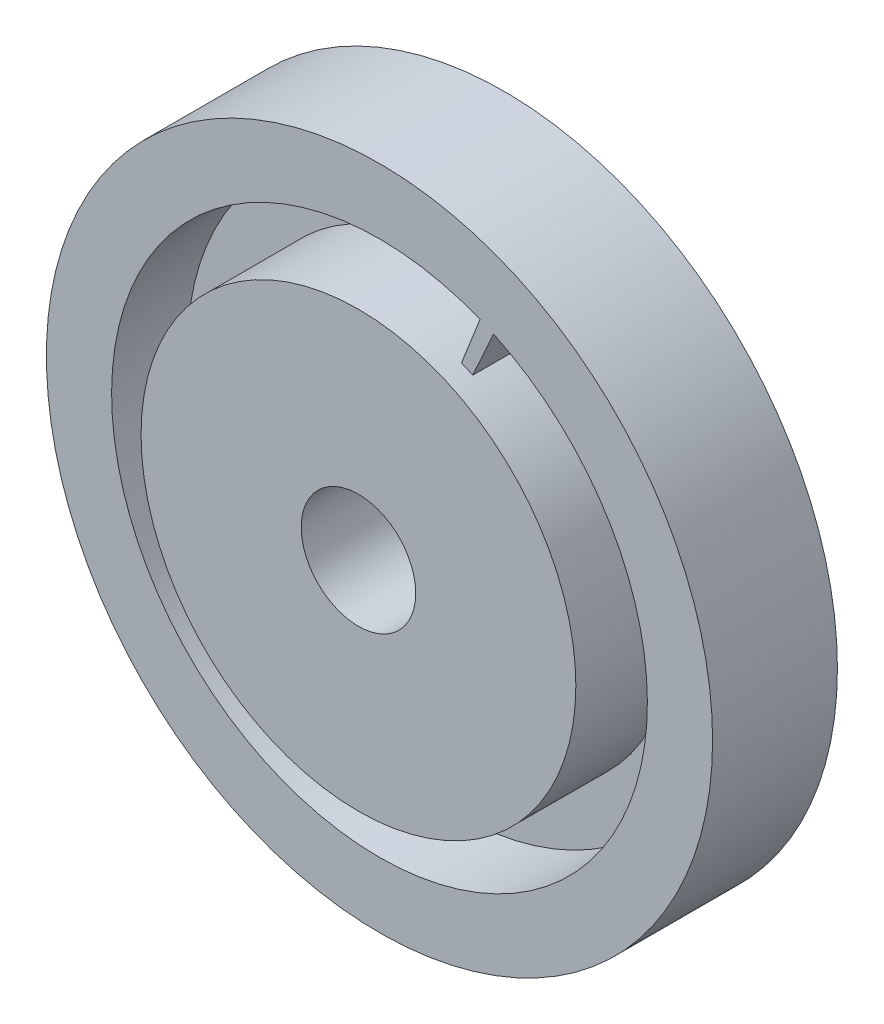
ISO-10303-21;
HEADER;
FILE_DESCRIPTION(('STEP AP214'),'2;1');
FILE_NAME('part.step','',(''),(''),'','','');
FILE_SCHEMA(('AUTOMOTIVE_DESIGN { 1 0 10303 214 1 1 1 1 }'));
ENDSEC;
DATA;
#1=APPLICATION_CONTEXT('core data for automotive mechanical design processes');
#2=APPLICATION_PROTOCOL_DEFINITION('international standard','automotive_design',2000,#1);
#3=PRODUCT_CONTEXT('',#1,'mechanical');
#4=PRODUCT('Part','Part','',(#3));
#5=PRODUCT_RELATED_PRODUCT_CATEGORY('part','',(#4));
#6=PRODUCT_DEFINITION_FORMATION('','',#4);
#7=PRODUCT_DEFINITION_CONTEXT('part definition',#1,'design');
#8=PRODUCT_DEFINITION('design','',#6,#7);
#9=PRODUCT_DEFINITION_SHAPE('','',#8);
#10=(LENGTH_UNIT() NAMED_UNIT(*) SI_UNIT(.MILLI.,.METRE.));
#11=(NAMED_UNIT(*) PLANE_ANGLE_UNIT() SI_UNIT($,.RADIAN.));
#12=(NAMED_UNIT(*) SI_UNIT($,.STERADIAN.) SOLID_ANGLE_UNIT());
#13=UNCERTAINTY_MEASURE_WITH_UNIT(LENGTH_MEASURE(1.E-05),#10,'distance_accuracy_value','');
#14=(GEOMETRIC_REPRESENTATION_CONTEXT(3) GLOBAL_UNCERTAINTY_ASSIGNED_CONTEXT((#13)) GLOBAL_UNIT_ASSIGNED_CONTEXT((#10,
#11,#12)) REPRESENTATION_CONTEXT('',''));
#15=CARTESIAN_POINT('',(0.,0.,0.));
#16=DIRECTION('',(0.,0.,1.));
#17=DIRECTION('',(1.,0.,0.));
#18=AXIS2_PLACEMENT_3D('',#15,#16,#17);
#19=CARTESIAN_POINT('',(0.,0.,8.9));
#20=DIRECTION('',(0.,0.,1.));
#21=DIRECTION('',(1.,0.,0.));
#22=AXIS2_PLACEMENT_3D('',#19,#20,#21);
#23=PLANE('',#22);
#24=CARTESIAN_POINT('',(0.,0.,8.9));
#25=DIRECTION('',(0.,0.,1.));
#26=DIRECTION('',(1.,0.,0.));
#27=AXIS2_PLACEMENT_3D('',#24,#25,#26);
#28=CIRCLE('',#27,23.75);
#29=CARTESIAN_POINT('',(23.75,0.,8.9));
#30=VERTEX_POINT('',#29);
#31=EDGE_CURVE('E52',#30,#30,#28,.T.);
#32=ORIENTED_EDGE('',*,*,#31,.T.);
#33=EDGE_LOOP('',(#32));
#34=FACE_BOUND('',#33,.T.);
#35=CARTESIAN_POINT('',(0.,0.,8.9));
#36=DIRECTION('',(0.,0.,-1.));
#37=DIRECTION('',(-1.,0.,0.));
#38=AXIS2_PLACEMENT_3D('',#35,#36,#37);
#39=CIRCLE('',#38,19.1);
#40=CARTESIAN_POINT('',(8.12847981142001,17.2840335557224,8.9));
#41=VERTEX_POINT('',#40);
#42=CARTESIAN_POINT('',(7.16759448500293,17.7041122143573,8.9));
#43=VERTEX_POINT('',#42);
#44=EDGE_CURVE('E116',#41,#43,#39,.T.);
#45=ORIENTED_EDGE('',*,*,#44,.T.);
#46=DIRECTION('',(-0.366325854408053,-0.930486629883638,0.));
#47=VECTOR('',#46,1.);
#48=CARTESIAN_POINT('',(5.8487460967067,14.3541690493131,8.9));
#49=LINE('',#48,#47);
#50=CARTESIAN_POINT('',(5.84874609670669,14.3541690493131,8.9));
#51=VERTEX_POINT('',#50);
#52=EDGE_CURVE('E120',#43,#51,#49,.T.);
#53=ORIENTED_EDGE('',*,*,#52,.T.);
#54=CARTESIAN_POINT('',(0.,0.,8.9));
#55=DIRECTION('',(0.,0.,1.));
#56=DIRECTION('',(1.,0.,0.));
#57=AXIS2_PLACEMENT_3D('',#54,#55,#56);
#58=CIRCLE('',#57,15.5);
#59=CARTESIAN_POINT('',(6.64836067127312,14.0017606173177,8.9));
#60=VERTEX_POINT('',#59);
#61=EDGE_CURVE('E11',#60,#51,#58,.T.);
#62=ORIENTED_EDGE('',*,*,#61,.F.);
#63=DIRECTION('',(0.411079689049984,0.911599412708547,0.));
#64=VECTOR('',#63,1.);
#65=CARTESIAN_POINT('',(6.64836067127312,14.0017606173177,8.9));
#66=LINE('',#65,#64);
#67=EDGE_CURVE('E60',#60,#41,#66,.T.);
#68=ORIENTED_EDGE('',*,*,#67,.T.);
#69=EDGE_LOOP('',(#45,#53,#62,#68));
#70=FACE_BOUND('',#69,.T.);
#71=ADVANCED_FACE('F42',(#34,#70),#23,.T.);
#72=CARTESIAN_POINT('',(0.,0.,8.9));
#73=DIRECTION('',(0.,0.,-1.));
#74=DIRECTION('',(-1.,0.,0.));
#75=AXIS2_PLACEMENT_3D('',#72,#73,#74);
#76=CYLINDRICAL_SURFACE('',#75,23.75);
#77=ORIENTED_EDGE('',*,*,#31,.F.);
#78=EDGE_LOOP('',(#77));
#79=FACE_BOUND('',#78,.T.);
#80=CARTESIAN_POINT('',(0.,0.,0.));
#81=DIRECTION('',(0.,0.,1.));
#82=DIRECTION('',(1.,0.,0.));
#83=AXIS2_PLACEMENT_3D('',#80,#81,#82);
#84=CIRCLE('',#83,23.75);
#85=CARTESIAN_POINT('',(23.75,0.,0.));
#86=VERTEX_POINT('',#85);
#87=EDGE_CURVE('E46',#86,#86,#84,.T.);
#88=ORIENTED_EDGE('',*,*,#87,.T.);
#89=EDGE_LOOP('',(#88));
#90=FACE_BOUND('',#89,.T.);
#91=ADVANCED_FACE('F44',(#79,#90),#76,.T.);
#92=CARTESIAN_POINT('',(0.,0.,0.));
#93=DIRECTION('',(0.,0.,1.));
#94=DIRECTION('',(1.,0.,0.));
#95=AXIS2_PLACEMENT_3D('',#92,#93,#94);
#96=PLANE('',#95);
#97=CARTESIAN_POINT('',(0.,0.,0.));
#98=DIRECTION('',(0.,0.,1.));
#99=DIRECTION('',(1.,0.,0.));
#100=AXIS2_PLACEMENT_3D('',#97,#98,#99);
#101=CIRCLE('',#100,4.08);
#102=CARTESIAN_POINT('',(4.08,0.,0.));
#103=VERTEX_POINT('',#102);
#104=EDGE_CURVE('E121',#103,#103,#101,.F.);
#105=ORIENTED_EDGE('',*,*,#104,.F.);
#106=EDGE_LOOP('',(#105));
#107=FACE_BOUND('',#106,.T.);
#108=ORIENTED_EDGE('',*,*,#87,.F.);
#109=EDGE_LOOP('',(#108));
#110=FACE_BOUND('',#109,.T.);
#111=ADVANCED_FACE('F144',(#107,#110),#96,.F.);
#112=CARTESIAN_POINT('',(0.,0.,10.4));
#113=DIRECTION('',(0.,0.,-1.));
#114=DIRECTION('',(-1.,0.,0.));
#115=AXIS2_PLACEMENT_3D('',#112,#113,#114);
#116=CYLINDRICAL_SURFACE('',#115,15.5);
#117=ORIENTED_EDGE('',*,*,#61,.T.);
#118=DIRECTION('',(0.,0.,1.));
#119=VECTOR('',#118,1.);
#120=CARTESIAN_POINT('',(5.84874609670669,14.3541690493131,3.5));
#121=LINE('',#120,#119);
#122=CARTESIAN_POINT('',(5.84874609670669,14.3541690493131,3.5));
#123=VERTEX_POINT('',#122);
#124=EDGE_CURVE('E94',#123,#51,#121,.T.);
#125=ORIENTED_EDGE('',*,*,#124,.F.);
#126=CARTESIAN_POINT('',(0.,0.,3.5));
#127=DIRECTION('',(0.,0.,1.));
#128=DIRECTION('',(1.,0.,0.));
#129=AXIS2_PLACEMENT_3D('',#126,#127,#128);
#130=CIRCLE('',#129,15.5);
#131=CARTESIAN_POINT('',(6.64836067127312,14.0017606173177,3.5));
#132=VERTEX_POINT('',#131);
#133=EDGE_CURVE('E99',#123,#132,#130,.T.);
#134=ORIENTED_EDGE('',*,*,#133,.T.);
#135=DIRECTION('',(0.,0.,1.));
#136=VECTOR('',#135,1.);
#137=CARTESIAN_POINT('',(6.64836067127312,14.0017606173177,3.5));
#138=LINE('',#137,#136);
#139=EDGE_CURVE('E107',#132,#60,#138,.T.);
#140=ORIENTED_EDGE('',*,*,#139,.T.);
#141=EDGE_LOOP('',(#117,#125,#134,#140));
#142=FACE_BOUND('',#141,.T.);
#143=CARTESIAN_POINT('',(0.,0.,10.4));
#144=DIRECTION('',(0.,0.,-1.));
#145=DIRECTION('',(-1.,0.,0.));
#146=AXIS2_PLACEMENT_3D('',#143,#144,#145);
#147=CIRCLE('',#146,15.5);
#148=CARTESIAN_POINT('',(-15.5,0.,10.4));
#149=VERTEX_POINT('',#148);
#150=EDGE_CURVE('E132',#149,#149,#147,.T.);
#151=ORIENTED_EDGE('',*,*,#150,.T.);
#152=EDGE_LOOP('',(#151));
#153=FACE_BOUND('',#152,.T.);
#154=ADVANCED_FACE('F103',(#142,#153),#116,.T.);
#155=CARTESIAN_POINT('',(0.,0.,10.4));
#156=DIRECTION('',(0.,0.,-1.));
#157=DIRECTION('',(-1.,0.,0.));
#158=AXIS2_PLACEMENT_3D('',#155,#156,#157);
#159=PLANE('',#158);
#160=CARTESIAN_POINT('',(0.,0.,10.4));
#161=DIRECTION('',(0.,0.,1.));
#162=DIRECTION('',(1.,0.,0.));
#163=AXIS2_PLACEMENT_3D('',#160,#161,#162);
#164=CIRCLE('',#163,4.08);
#165=CARTESIAN_POINT('',(4.08,0.,10.4));
#166=VERTEX_POINT('',#165);
#167=EDGE_CURVE('E183',#166,#166,#164,.T.);
#168=ORIENTED_EDGE('',*,*,#167,.F.);
#169=EDGE_LOOP('',(#168));
#170=FACE_BOUND('',#169,.T.);
#171=ORIENTED_EDGE('',*,*,#150,.F.);
#172=EDGE_LOOP('',(#171));
#173=FACE_BOUND('',#172,.T.);
#174=ADVANCED_FACE('F151',(#170,#173),#159,.F.);
#175=CARTESIAN_POINT('',(0.,0.,3.5));
#176=DIRECTION('',(0.,0.,1.));
#177=DIRECTION('',(1.,0.,0.));
#178=AXIS2_PLACEMENT_3D('',#175,#176,#177);
#179=CYLINDRICAL_SURFACE('',#178,19.1);
#180=ORIENTED_EDGE('',*,*,#44,.F.);
#181=DIRECTION('',(0.,0.,1.));
#182=VECTOR('',#181,1.);
#183=CARTESIAN_POINT('',(8.12847981142001,17.2840335557224,3.5));
#184=LINE('',#183,#182);
#185=CARTESIAN_POINT('',(8.12847981142001,17.2840335557224,3.5));
#186=VERTEX_POINT('',#185);
#187=EDGE_CURVE('E80',#186,#41,#184,.T.);
#188=ORIENTED_EDGE('',*,*,#187,.F.);
#189=CARTESIAN_POINT('',(0.,0.,3.5));
#190=DIRECTION('',(0.,0.,-1.));
#191=DIRECTION('',(-1.,0.,0.));
#192=AXIS2_PLACEMENT_3D('',#189,#190,#191);
#193=CIRCLE('',#192,19.1);
#194=CARTESIAN_POINT('',(7.16759448500293,17.7041122143573,3.5));
#195=VERTEX_POINT('',#194);
#196=EDGE_CURVE('E100',#186,#195,#193,.T.);
#197=ORIENTED_EDGE('',*,*,#196,.T.);
#198=DIRECTION('',(0.,0.,1.));
#199=VECTOR('',#198,1.);
#200=CARTESIAN_POINT('',(7.16759448500293,17.7041122143573,3.5));
#201=LINE('',#200,#199);
#202=EDGE_CURVE('E97',#195,#43,#201,.T.);
#203=ORIENTED_EDGE('',*,*,#202,.T.);
#204=EDGE_LOOP('',(#180,#188,#197,#203));
#205=FACE_BOUND('',#204,.T.);
#206=ADVANCED_FACE('F163',(#205),#179,.F.);
#207=CARTESIAN_POINT('',(5.8487460967067,14.3541690493131,3.5));
#208=DIRECTION('',(-0.930486629883638,0.366325854408053,0.));
#209=DIRECTION('',(-0.366325854408053,-0.930486629883638,0.));
#210=AXIS2_PLACEMENT_3D('',#207,#208,#209);
#211=PLANE('',#210);
#212=ORIENTED_EDGE('',*,*,#52,.F.);
#213=ORIENTED_EDGE('',*,*,#202,.F.);
#214=DIRECTION('',(-0.366325854408053,-0.930486629883638,0.));
#215=VECTOR('',#214,1.);
#216=CARTESIAN_POINT('',(5.8487460967067,14.3541690493131,3.5));
#217=LINE('',#216,#215);
#218=EDGE_CURVE('E88',#195,#123,#217,.T.);
#219=ORIENTED_EDGE('',*,*,#218,.T.);
#220=ORIENTED_EDGE('',*,*,#124,.T.);
#221=EDGE_LOOP('',(#212,#213,#219,#220));
#222=FACE_BOUND('',#221,.T.);
#223=ADVANCED_FACE('F93',(#222),#211,.T.);
#224=CARTESIAN_POINT('',(6.64836067127312,14.0017606173177,3.5));
#225=DIRECTION('',(0.911599412708547,-0.411079689049984,0.));
#226=DIRECTION('',(0.411079689049984,0.911599412708547,0.));
#227=AXIS2_PLACEMENT_3D('',#224,#225,#226);
#228=PLANE('',#227);
#229=ORIENTED_EDGE('',*,*,#67,.F.);
#230=ORIENTED_EDGE('',*,*,#139,.F.);
#231=DIRECTION('',(0.411079689049984,0.911599412708547,0.));
#232=VECTOR('',#231,1.);
#233=CARTESIAN_POINT('',(6.64836067127312,14.0017606173177,3.5));
#234=LINE('',#233,#232);
#235=EDGE_CURVE('E66',#132,#186,#234,.T.);
#236=ORIENTED_EDGE('',*,*,#235,.T.);
#237=ORIENTED_EDGE('',*,*,#187,.T.);
#238=EDGE_LOOP('',(#229,#230,#236,#237));
#239=FACE_BOUND('',#238,.T.);
#240=ADVANCED_FACE('F170',(#239),#228,.T.);
#241=CARTESIAN_POINT('',(0.,0.,3.5));
#242=DIRECTION('',(0.,0.,-1.));
#243=DIRECTION('',(-1.,0.,0.));
#244=AXIS2_PLACEMENT_3D('',#241,#242,#243);
#245=PLANE('',#244);
#246=ORIENTED_EDGE('',*,*,#196,.F.);
#247=ORIENTED_EDGE('',*,*,#235,.F.);
#248=ORIENTED_EDGE('',*,*,#133,.F.);
#249=ORIENTED_EDGE('',*,*,#218,.F.);
#250=EDGE_LOOP('',(#246,#247,#248,#249));
#251=FACE_BOUND('',#250,.T.);
#252=ADVANCED_FACE('F109',(#251),#245,.F.);
#253=CARTESIAN_POINT('',(0.,0.,-0.000999999999999265));
#254=DIRECTION('',(0.,0.,1.));
#255=DIRECTION('',(1.,0.,0.));
#256=AXIS2_PLACEMENT_3D('',#253,#254,#255);
#257=CYLINDRICAL_SURFACE('',#256,4.08);
#258=ORIENTED_EDGE('',*,*,#167,.T.);
#259=EDGE_LOOP('',(#258));
#260=FACE_BOUND('',#259,.T.);
#261=ORIENTED_EDGE('',*,*,#104,.T.);
#262=EDGE_LOOP('',(#261));
#263=FACE_BOUND('',#262,.T.);
#264=ADVANCED_FACE('F175',(#260,#263),#257,.F.);
#265=CLOSED_SHELL('',(#71,#91,#111,#154,#174,#206,#223,#240,#252,#264));
#266=MANIFOLD_SOLID_BREP('B2',#265);
#267=ADVANCED_BREP_SHAPE_REPRESENTATION('',(#18,#266),#14);
#268=SHAPE_DEFINITION_REPRESENTATION(#9,#267);
ENDSEC;
END-ISO-10303-21;
